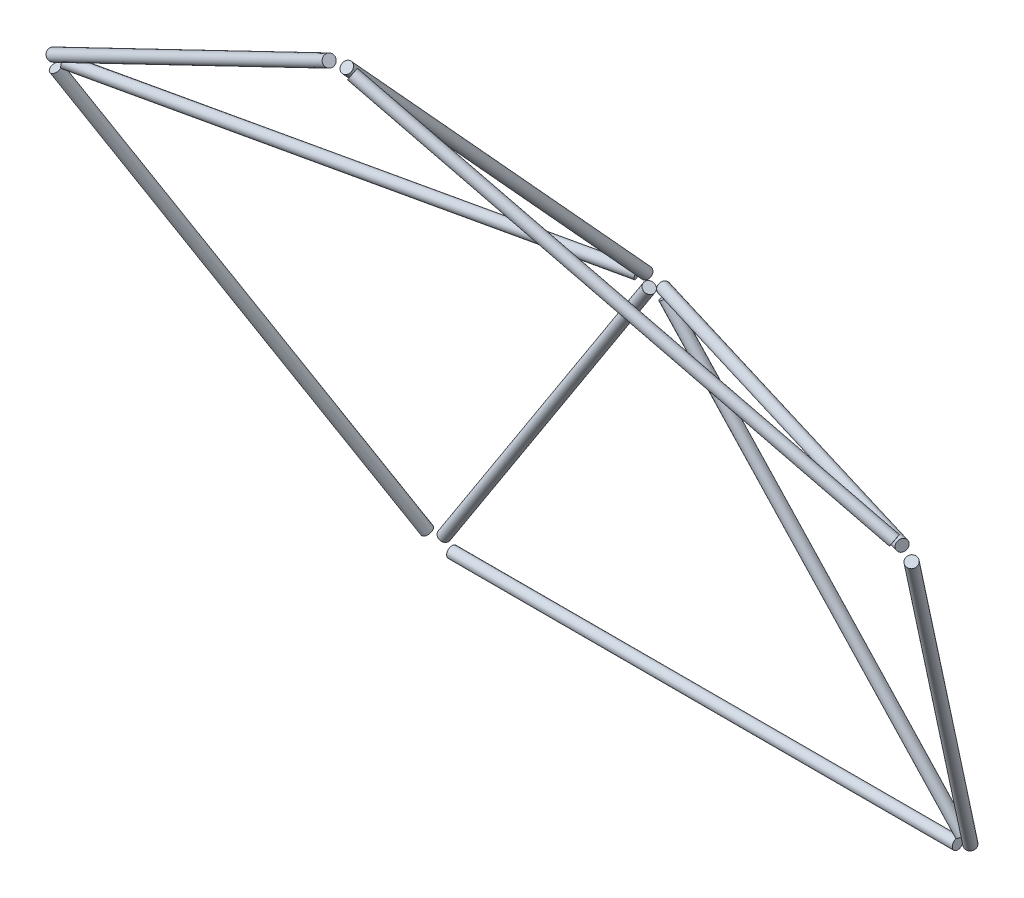
ISO-10303-21;
HEADER;
FILE_DESCRIPTION(('STEP AP214'),'2;1');
FILE_NAME('part.step','',(''),(''),'','','');
FILE_SCHEMA(('AUTOMOTIVE_DESIGN { 1 0 10303 214 1 1 1 1 }'));
ENDSEC;
DATA;
#1=APPLICATION_CONTEXT('core data for automotive mechanical design processes');
#2=APPLICATION_PROTOCOL_DEFINITION('international standard','automotive_design',2000,#1);
#3=PRODUCT_CONTEXT('',#1,'mechanical');
#4=PRODUCT('Part','Part','',(#3));
#5=PRODUCT_RELATED_PRODUCT_CATEGORY('part','',(#4));
#6=PRODUCT_DEFINITION_FORMATION('','',#4);
#7=PRODUCT_DEFINITION_CONTEXT('part definition',#1,'design');
#8=PRODUCT_DEFINITION('design','',#6,#7);
#9=PRODUCT_DEFINITION_SHAPE('','',#8);
#10=(LENGTH_UNIT() NAMED_UNIT(*) SI_UNIT(.MILLI.,.METRE.));
#11=(NAMED_UNIT(*) PLANE_ANGLE_UNIT() SI_UNIT($,.RADIAN.));
#12=(NAMED_UNIT(*) SI_UNIT($,.STERADIAN.) SOLID_ANGLE_UNIT());
#13=UNCERTAINTY_MEASURE_WITH_UNIT(LENGTH_MEASURE(1.E-05),#10,'distance_accuracy_value','');
#14=(GEOMETRIC_REPRESENTATION_CONTEXT(3) GLOBAL_UNCERTAINTY_ASSIGNED_CONTEXT((#13)) GLOBAL_UNIT_ASSIGNED_CONTEXT((#10,
#11,#12)) REPRESENTATION_CONTEXT('',''));
#15=CARTESIAN_POINT('',(0.,0.,0.));
#16=DIRECTION('',(0.,0.,1.));
#17=DIRECTION('',(1.,0.,0.));
#18=AXIS2_PLACEMENT_3D('',#15,#16,#17);
#19=CARTESIAN_POINT('',(3.23606797750098,202.053269556013,-127.226929132831));
#20=DIRECTION('',(0.809016994374942,-0.525731112119141,-0.262865556059569));
#21=DIRECTION('',(0.,0.447213595499956,-0.894427190999917));
#22=AXIS2_PLACEMENT_3D('',#19,#20,#21);
#23=PLANE('',#22);
#24=CARTESIAN_POINT('',(3.23606797750098,202.053269556013,-127.226929132831));
#25=DIRECTION('',(0.809016994374942,-0.525731112119141,-0.262865556059569));
#26=DIRECTION('',(0.,0.447213595499956,-0.894427190999917));
#27=AXIS2_PLACEMENT_3D('',#24,#25,#26);
#28=CIRCLE('',#27,1.49999999999999);
#29=CARTESIAN_POINT('',(3.23606797750098,202.724089949263,-128.568569919331));
#30=VERTEX_POINT('',#29);
#31=EDGE_CURVE('E68',#30,#30,#28,.T.);
#32=ORIENTED_EDGE('',*,*,#31,.F.);
#33=EDGE_LOOP('',(#32));
#34=FACE_BOUND('',#33,.T.);
#35=ADVANCED_FACE('F62',(#34),#23,.F.);
#36=CARTESIAN_POINT('',(116.763932022501,128.278391357067,-164.114368232304));
#37=DIRECTION('',(0.809016994374942,-0.525731112119141,-0.262865556059569));
#38=DIRECTION('',(0.,0.447213595499956,-0.894427190999917));
#39=AXIS2_PLACEMENT_3D('',#36,#37,#38);
#40=PLANE('',#39);
#41=CARTESIAN_POINT('',(116.763932022501,128.278391357067,-164.114368232304));
#42=DIRECTION('',(0.809016994374942,-0.525731112119141,-0.262865556059569));
#43=DIRECTION('',(0.,0.447213595499956,-0.894427190999917));
#44=AXIS2_PLACEMENT_3D('',#41,#42,#43);
#45=CIRCLE('',#44,1.49999999999999);
#46=CARTESIAN_POINT('',(116.763932022501,128.949211750317,-165.456009018804));
#47=VERTEX_POINT('',#46);
#48=EDGE_CURVE('E13',#47,#47,#45,.T.);
#49=ORIENTED_EDGE('',*,*,#48,.T.);
#50=EDGE_LOOP('',(#49));
#51=FACE_BOUND('',#50,.T.);
#52=ADVANCED_FACE('F77',(#51),#40,.T.);
#53=CARTESIAN_POINT('',(3.23606797750098,202.053269556013,-127.226929132831));
#54=DIRECTION('',(0.809016994374941,-0.525731112119142,-0.262865556059569));
#55=DIRECTION('',(0.,0.447213595499955,-0.894427190999917));
#56=AXIS2_PLACEMENT_3D('',#53,#54,#55);
#57=CYLINDRICAL_SURFACE('',#56,1.49999999999999);
#58=ORIENTED_EDGE('',*,*,#48,.F.);
#59=EDGE_LOOP('',(#58));
#60=FACE_BOUND('',#59,.T.);
#61=ORIENTED_EDGE('',*,*,#31,.T.);
#62=EDGE_LOOP('',(#61));
#63=FACE_BOUND('',#62,.T.);
#64=ADVANCED_FACE('F74',(#60,#63),#57,.T.);
#65=CLOSED_SHELL('',(#35,#52,#64));
#66=MANIFOLD_SOLID_BREP('B2',#65);
#67=CARTESIAN_POINT('',(-116.763932022499,128.278391357069,-164.114368232303));
#68=DIRECTION('',(0.809016994374952,0.525731112119129,0.262865556059564));
#69=DIRECTION('',(0.,0.447213595499955,-0.894427190999918));
#70=AXIS2_PLACEMENT_3D('',#67,#68,#69);
#71=PLANE('',#70);
#72=CARTESIAN_POINT('',(-116.763932022499,128.278391357069,-164.114368232303));
#73=DIRECTION('',(0.809016994374952,0.525731112119129,0.262865556059564));
#74=DIRECTION('',(0.,0.447213595499955,-0.894427190999918));
#75=AXIS2_PLACEMENT_3D('',#72,#73,#74);
#76=CIRCLE('',#75,1.49999999999999);
#77=CARTESIAN_POINT('',(-116.763932022499,128.949211750319,-165.456009018803));
#78=VERTEX_POINT('',#77);
#79=EDGE_CURVE('E125',#78,#78,#76,.T.);
#80=ORIENTED_EDGE('',*,*,#79,.F.);
#81=EDGE_LOOP('',(#80));
#82=FACE_BOUND('',#81,.T.);
#83=ADVANCED_FACE('F119',(#82),#71,.F.);
#84=CARTESIAN_POINT('',(-3.23606797749835,202.053269556013,-127.226929132831));
#85=DIRECTION('',(0.809016994374952,0.525731112119129,0.262865556059564));
#86=DIRECTION('',(0.,0.447213595499955,-0.894427190999918));
#87=AXIS2_PLACEMENT_3D('',#84,#85,#86);
#88=PLANE('',#87);
#89=CARTESIAN_POINT('',(-3.23606797749835,202.053269556013,-127.226929132831));
#90=DIRECTION('',(0.809016994374952,0.525731112119129,0.262865556059564));
#91=DIRECTION('',(0.,0.447213595499955,-0.894427190999918));
#92=AXIS2_PLACEMENT_3D('',#89,#90,#91);
#93=CIRCLE('',#92,1.49999999999999);
#94=CARTESIAN_POINT('',(-3.23606797749835,202.724089949263,-128.568569919331));
#95=VERTEX_POINT('',#94);
#96=EDGE_CURVE('E61',#95,#95,#93,.T.);
#97=ORIENTED_EDGE('',*,*,#96,.T.);
#98=EDGE_LOOP('',(#97));
#99=FACE_BOUND('',#98,.T.);
#100=ADVANCED_FACE('F134',(#99),#88,.T.);
#101=CARTESIAN_POINT('',(-116.763932022499,128.278391357069,-164.114368232303));
#102=DIRECTION('',(0.809016994374952,0.525731112119128,0.262865556059563));
#103=DIRECTION('',(0.,0.447213595499955,-0.894427190999917));
#104=AXIS2_PLACEMENT_3D('',#101,#102,#103);
#105=CYLINDRICAL_SURFACE('',#104,1.49999999999999);
#106=ORIENTED_EDGE('',*,*,#96,.F.);
#107=EDGE_LOOP('',(#106));
#108=FACE_BOUND('',#107,.T.);
#109=ORIENTED_EDGE('',*,*,#79,.T.);
#110=EDGE_LOOP('',(#109));
#111=FACE_BOUND('',#110,.T.);
#112=ADVANCED_FACE('F131',(#108,#111),#105,.T.);
#113=CLOSED_SHELL('',(#83,#100,#112));
#114=MANIFOLD_SOLID_BREP('B8',#113);
#115=CARTESIAN_POINT('',(-75.4001466274869,3.4026032334083,-226.552262294133));
#116=DIRECTION('',(-0.309016994374944,0.850650808352042,0.425325404176018));
#117=DIRECTION('',(0.,0.447213595499956,-0.894427190999917));
#118=AXIS2_PLACEMENT_3D('',#115,#116,#117);
#119=PLANE('',#118);
#120=CARTESIAN_POINT('',(-75.4001466274869,3.4026032334083,-226.552262294133));
#121=DIRECTION('',(-0.309016994374944,0.850650808352042,0.425325404176018));
#122=DIRECTION('',(0.,0.447213595499956,-0.894427190999917));
#123=AXIS2_PLACEMENT_3D('',#120,#121,#122);
#124=CIRCLE('',#123,1.49999999999999);
#125=CARTESIAN_POINT('',(-75.4001466274869,4.07342362665823,-227.893903080633));
#126=VERTEX_POINT('',#125);
#127=EDGE_CURVE('E182',#126,#126,#124,.T.);
#128=ORIENTED_EDGE('',*,*,#127,.F.);
#129=EDGE_LOOP('',(#128));
#130=FACE_BOUND('',#129,.T.);
#131=ADVANCED_FACE('F176',(#130),#119,.F.);
#132=CARTESIAN_POINT('',(-118.763932022499,122.772863675184,-166.867132073245));
#133=DIRECTION('',(-0.309016994374944,0.850650808352042,0.425325404176018));
#134=DIRECTION('',(0.,0.447213595499956,-0.894427190999917));
#135=AXIS2_PLACEMENT_3D('',#132,#133,#134);
#136=PLANE('',#135);
#137=CARTESIAN_POINT('',(-118.763932022499,122.772863675184,-166.867132073245));
#138=DIRECTION('',(-0.309016994374944,0.850650808352042,0.425325404176018));
#139=DIRECTION('',(0.,0.447213595499956,-0.894427190999917));
#140=AXIS2_PLACEMENT_3D('',#137,#138,#139);
#141=CIRCLE('',#140,1.49999999999999);
#142=CARTESIAN_POINT('',(-118.763932022499,123.443684068434,-168.208772859745));
#143=VERTEX_POINT('',#142);
#144=EDGE_CURVE('E118',#143,#143,#141,.T.);
#145=ORIENTED_EDGE('',*,*,#144,.T.);
#146=EDGE_LOOP('',(#145));
#147=FACE_BOUND('',#146,.T.);
#148=ADVANCED_FACE('F191',(#147),#136,.T.);
#149=CARTESIAN_POINT('',(-75.4001466274869,3.4026032334083,-226.552262294133));
#150=DIRECTION('',(-0.309016994374943,0.850650808352043,0.425325404176018));
#151=DIRECTION('',(0.,0.447213595499956,-0.894427190999916));
#152=AXIS2_PLACEMENT_3D('',#149,#150,#151);
#153=CYLINDRICAL_SURFACE('',#152,1.49999999999999);
#154=ORIENTED_EDGE('',*,*,#144,.F.);
#155=EDGE_LOOP('',(#154));
#156=FACE_BOUND('',#155,.T.);
#157=ORIENTED_EDGE('',*,*,#127,.T.);
#158=EDGE_LOOP('',(#157));
#159=FACE_BOUND('',#158,.T.);
#160=ADVANCED_FACE('F188',(#156,#159),#153,.T.);
#161=CLOSED_SHELL('',(#131,#148,#160));
#162=MANIFOLD_SOLID_BREP('B56',#161);
#163=CARTESIAN_POINT('',(70.1640786499876,0.,-228.253563910837));
#164=DIRECTION('',(-1.,0.,0.));
#165=DIRECTION('',(0.,0.447213595499958,-0.894427190999916));
#166=AXIS2_PLACEMENT_3D('',#163,#164,#165);
#167=PLANE('',#166);
#168=CARTESIAN_POINT('',(70.1640786499876,0.,-228.253563910837));
#169=DIRECTION('',(-1.,0.,0.));
#170=DIRECTION('',(0.,0.447213595499958,-0.894427190999916));
#171=AXIS2_PLACEMENT_3D('',#168,#169,#170);
#172=CIRCLE('',#171,1.49999999999999);
#173=CARTESIAN_POINT('',(70.1640786499876,0.670820393249941,-229.595204697337));
#174=VERTEX_POINT('',#173);
#175=EDGE_CURVE('E239',#174,#174,#172,.T.);
#176=ORIENTED_EDGE('',*,*,#175,.F.);
#177=EDGE_LOOP('',(#176));
#178=FACE_BOUND('',#177,.T.);
#179=ADVANCED_FACE('F233',(#178),#167,.F.);
#180=CARTESIAN_POINT('',(-70.1640786499872,3.46944695195361E-13,-228.253563910837));
#181=DIRECTION('',(-1.,0.,0.));
#182=DIRECTION('',(0.,0.447213595499958,-0.894427190999916));
#183=AXIS2_PLACEMENT_3D('',#180,#181,#182);
#184=PLANE('',#183);
#185=CARTESIAN_POINT('',(-70.1640786499872,3.46944695195361E-13,-228.253563910837));
#186=DIRECTION('',(-1.,0.,0.));
#187=DIRECTION('',(0.,0.447213595499958,-0.894427190999916));
#188=AXIS2_PLACEMENT_3D('',#185,#186,#187);
#189=CIRCLE('',#188,1.49999999999999);
#190=CARTESIAN_POINT('',(-70.1640786499872,0.670820393250281,-229.595204697337));
#191=VERTEX_POINT('',#190);
#192=EDGE_CURVE('E175',#191,#191,#189,.T.);
#193=ORIENTED_EDGE('',*,*,#192,.T.);
#194=EDGE_LOOP('',(#193));
#195=FACE_BOUND('',#194,.T.);
#196=ADVANCED_FACE('F248',(#195),#184,.T.);
#197=CARTESIAN_POINT('',(70.1640786499876,0.,-228.253563910837));
#198=DIRECTION('',(-1.,0.,0.));
#199=DIRECTION('',(0.,0.447213595499958,-0.894427190999916));
#200=AXIS2_PLACEMENT_3D('',#197,#198,#199);
#201=CYLINDRICAL_SURFACE('',#200,1.49999999999999);
#202=ORIENTED_EDGE('',*,*,#192,.F.);
#203=EDGE_LOOP('',(#202));
#204=FACE_BOUND('',#203,.T.);
#205=ORIENTED_EDGE('',*,*,#175,.T.);
#206=EDGE_LOOP('',(#205));
#207=FACE_BOUND('',#206,.T.);
#208=ADVANCED_FACE('F245',(#204,#207),#201,.T.);
#209=CLOSED_SHELL('',(#179,#196,#208));
#210=MANIFOLD_SOLID_BREP('B113',#209);
#211=CARTESIAN_POINT('',(3.65943097377854,107.90592178459,-213.153111338432));
#212=DIRECTION('',(0.914857743444657,0.143664716150187,0.377353625387165));
#213=DIRECTION('',(-0.229343174999498,0.954060902804784,0.19279393616105));
#214=AXIS2_PLACEMENT_3D('',#211,#212,#213);
#215=PLANE('',#214);
#216=CARTESIAN_POINT('',(3.65943097377854,107.90592178459,-213.153111338432));
#217=DIRECTION('',(0.914857743444657,0.143664716150187,0.377353625387165));
#218=DIRECTION('',(-0.229343174999498,0.954060902804784,0.19279393616105));
#219=AXIS2_PLACEMENT_3D('',#216,#217,#218);
#220=CIRCLE('',#219,1.5);
#221=CARTESIAN_POINT('',(3.31541621127929,109.337013138797,-212.86392043419));
#222=VERTEX_POINT('',#221);
#223=EDGE_CURVE('E296',#222,#222,#220,.T.);
#224=ORIENTED_EDGE('',*,*,#223,.F.);
#225=EDGE_LOOP('',(#224));
#226=FACE_BOUND('',#225,.T.);
#227=ADVANCED_FACE('F290',(#226),#215,.F.);
#228=CARTESIAN_POINT('',(116.340569026222,125.60080804399,-166.675244958091));
#229=DIRECTION('',(0.914857743444657,0.143664716150187,0.377353625387165));
#230=DIRECTION('',(-0.229343174999498,0.954060902804784,0.19279393616105));
#231=AXIS2_PLACEMENT_3D('',#228,#229,#230);
#232=PLANE('',#231);
#233=CARTESIAN_POINT('',(116.340569026222,125.60080804399,-166.675244958091));
#234=DIRECTION('',(0.914857743444657,0.143664716150187,0.377353625387165));
#235=DIRECTION('',(-0.229343174999498,0.954060902804784,0.19279393616105));
#236=AXIS2_PLACEMENT_3D('',#233,#234,#235);
#237=CIRCLE('',#236,1.5);
#238=CARTESIAN_POINT('',(115.996554263722,127.031899398197,-166.386054053849));
#239=VERTEX_POINT('',#238);
#240=EDGE_CURVE('E232',#239,#239,#237,.T.);
#241=ORIENTED_EDGE('',*,*,#240,.T.);
#242=EDGE_LOOP('',(#241));
#243=FACE_BOUND('',#242,.T.);
#244=ADVANCED_FACE('F305',(#243),#232,.T.);
#245=CARTESIAN_POINT('',(3.65943097377854,107.90592178459,-213.153111338432));
#246=DIRECTION('',(0.914857743444657,0.143664716150186,0.377353625387164));
#247=DIRECTION('',(-0.229343174999497,0.954060902804784,0.192793936161051));
#248=AXIS2_PLACEMENT_3D('',#245,#246,#247);
#249=CYLINDRICAL_SURFACE('',#248,1.5);
#250=ORIENTED_EDGE('',*,*,#240,.F.);
#251=EDGE_LOOP('',(#250));
#252=FACE_BOUND('',#251,.T.);
#253=ORIENTED_EDGE('',*,*,#223,.T.);
#254=EDGE_LOOP('',(#253));
#255=FACE_BOUND('',#254,.T.);
#256=ADVANCED_FACE('F302',(#252,#255),#249,.T.);
#257=CLOSED_SHELL('',(#227,#244,#256));
#258=MANIFOLD_SOLID_BREP('B170',#257);
#259=CARTESIAN_POINT('',(4.37150315946155E-13,110.283964185361,-211.964090138046));
#260=DIRECTION('',(0.,0.738175316342915,0.674608925483526));
#261=DIRECTION('',(-0.964443775627104,0.178291116075975,-0.195090957203353));
#262=AXIS2_PLACEMENT_3D('',#259,#260,#261);
#263=PLANE('',#262);
#264=CARTESIAN_POINT('',(4.37150315946155E-13,110.283964185361,-211.964090138046));
#265=DIRECTION('',(0.,0.738175316342915,0.674608925483526));
#266=DIRECTION('',(-0.964443775627104,0.178291116075975,-0.195090957203353));
#267=AXIS2_PLACEMENT_3D('',#264,#265,#266);
#268=CIRCLE('',#267,1.5);
#269=CARTESIAN_POINT('',(-1.44666566344021,110.551400859475,-212.256726573851));
#270=VERTEX_POINT('',#269);
#271=EDGE_CURVE('E351',#270,#270,#268,.T.);
#272=ORIENTED_EDGE('',*,*,#271,.F.);
#273=EDGE_LOOP('',(#272));
#274=FACE_BOUND('',#273,.T.);
#275=ADVANCED_FACE('F345',(#274),#263,.F.);
#276=CARTESIAN_POINT('',(1.45716771982052E-12,201.203492739118,-128.873902610527));
#277=DIRECTION('',(0.,0.738175316342915,0.674608925483526));
#278=DIRECTION('',(-0.964443775627104,0.178291116075975,-0.195090957203353));
#279=AXIS2_PLACEMENT_3D('',#276,#277,#278);
#280=PLANE('',#279);
#281=CARTESIAN_POINT('',(1.45716771982052E-12,201.203492739118,-128.873902610527));
#282=DIRECTION('',(0.,0.738175316342915,0.674608925483526));
#283=DIRECTION('',(-0.964443775627104,0.178291116075975,-0.195090957203353));
#284=AXIS2_PLACEMENT_3D('',#281,#282,#283);
#285=CIRCLE('',#284,1.5);
#286=CARTESIAN_POINT('',(-1.44666566343919,201.470929413231,-129.166539046332));
#287=VERTEX_POINT('',#286);
#288=EDGE_CURVE('E289',#287,#287,#285,.T.);
#289=ORIENTED_EDGE('',*,*,#288,.T.);
#290=EDGE_LOOP('',(#289));
#291=FACE_BOUND('',#290,.T.);
#292=ADVANCED_FACE('F360',(#291),#280,.T.);
#293=CARTESIAN_POINT('',(4.37150315946155E-13,110.283964185361,-211.964090138046));
#294=DIRECTION('',(0.,0.738175316342915,0.674608925483526));
#295=DIRECTION('',(-0.964443775627104,0.178291116075975,-0.195090957203353));
#296=AXIS2_PLACEMENT_3D('',#293,#294,#295);
#297=CYLINDRICAL_SURFACE('',#296,1.5);
#298=ORIENTED_EDGE('',*,*,#288,.F.);
#299=EDGE_LOOP('',(#298));
#300=FACE_BOUND('',#299,.T.);
#301=ORIENTED_EDGE('',*,*,#271,.T.);
#302=EDGE_LOOP('',(#301));
#303=FACE_BOUND('',#302,.T.);
#304=ADVANCED_FACE('F357',(#300,#303),#297,.T.);
#305=CLOSED_SHELL('',(#275,#292,#304));
#306=MANIFOLD_SOLID_BREP('B227',#305);
#307=CARTESIAN_POINT('',(-3.65943097377783,107.90592178459,-213.153111338432));
#308=DIRECTION('',(-0.914857743444653,0.1436647161502,0.377353625387169));
#309=DIRECTION('',(-0.366715858576323,-0.686748851889798,-0.627610941186237));
#310=AXIS2_PLACEMENT_3D('',#307,#308,#309);
#311=PLANE('',#310);
#312=CARTESIAN_POINT('',(-3.65943097377783,107.90592178459,-213.153111338432));
#313=DIRECTION('',(-0.914857743444653,0.1436647161502,0.377353625387169));
#314=DIRECTION('',(-0.366715858576323,-0.686748851889798,-0.627610941186237));
#315=AXIS2_PLACEMENT_3D('',#312,#313,#314);
#316=CIRCLE('',#315,1.5);
#317=CARTESIAN_POINT('',(-4.20950476164232,106.875798506756,-214.094527750211));
#318=VERTEX_POINT('',#317);
#319=EDGE_CURVE('E402',#318,#318,#316,.T.);
#320=ORIENTED_EDGE('',*,*,#319,.F.);
#321=EDGE_LOOP('',(#320));
#322=FACE_BOUND('',#321,.T.);
#323=ADVANCED_FACE('F396',(#322),#311,.F.);
#324=CARTESIAN_POINT('',(-116.34056902622,125.600808043992,-166.67524495809));
#325=DIRECTION('',(-0.914857743444653,0.1436647161502,0.377353625387169));
#326=DIRECTION('',(-0.366715858576323,-0.686748851889798,-0.627610941186237));
#327=AXIS2_PLACEMENT_3D('',#324,#325,#326);
#328=PLANE('',#327);
#329=CARTESIAN_POINT('',(-116.34056902622,125.600808043992,-166.67524495809));
#330=DIRECTION('',(-0.914857743444653,0.1436647161502,0.377353625387169));
#331=DIRECTION('',(-0.366715858576323,-0.686748851889798,-0.627610941186237));
#332=AXIS2_PLACEMENT_3D('',#329,#330,#331);
#333=CIRCLE('',#332,1.5);
#334=CARTESIAN_POINT('',(-116.890642814085,124.570684766157,-167.616661369869));
#335=VERTEX_POINT('',#334);
#336=EDGE_CURVE('E344',#335,#335,#333,.T.);
#337=ORIENTED_EDGE('',*,*,#336,.T.);
#338=EDGE_LOOP('',(#337));
#339=FACE_BOUND('',#338,.T.);
#340=ADVANCED_FACE('F411',(#339),#328,.T.);
#341=CARTESIAN_POINT('',(-3.65943097377783,107.90592178459,-213.153111338432));
#342=DIRECTION('',(-0.914857743444653,0.143664716150201,0.37735362538717));
#343=DIRECTION('',(-0.366715858576324,-0.686748851889798,-0.627610941186237));
#344=AXIS2_PLACEMENT_3D('',#341,#342,#343);
#345=CYLINDRICAL_SURFACE('',#344,1.5);
#346=ORIENTED_EDGE('',*,*,#336,.F.);
#347=EDGE_LOOP('',(#346));
#348=FACE_BOUND('',#347,.T.);
#349=ORIENTED_EDGE('',*,*,#319,.T.);
#350=EDGE_LOOP('',(#349));
#351=FACE_BOUND('',#350,.T.);
#352=ADVANCED_FACE('F408',(#348,#351),#345,.T.);
#353=CLOSED_SHELL('',(#323,#340,#352));
#354=MANIFOLD_SOLID_BREP('B284',#353);
#355=CARTESIAN_POINT('',(-2.26165272127879,104.058168353455,-215.076988053999));
#356=DIRECTION('',(-0.56541318031983,-0.818273641633722,-0.10361555350479));
#357=DIRECTION('',(0.737800910813338,-0.445603166990952,-0.507038098736813));
#358=AXIS2_PLACEMENT_3D('',#355,#356,#357);
#359=PLANE('',#358);
#360=CARTESIAN_POINT('',(-2.26165272127879,104.058168353455,-215.076988053999));
#361=DIRECTION('',(-0.56541318031983,-0.818273641633722,-0.10361555350479));
#362=DIRECTION('',(0.737800910813338,-0.445603166990952,-0.507038098736813));
#363=AXIS2_PLACEMENT_3D('',#360,#361,#362);
#364=CIRCLE('',#363,1.5);
#365=CARTESIAN_POINT('',(-1.15495135505878,103.389763602969,-215.837545202104));
#366=VERTEX_POINT('',#365);
#367=EDGE_CURVE('E459',#366,#366,#364,.T.);
#368=ORIENTED_EDGE('',*,*,#367,.F.);
#369=EDGE_LOOP('',(#368));
#370=FACE_BOUND('',#369,.T.);
#371=ADVANCED_FACE('F453',(#370),#359,.F.);
#372=CARTESIAN_POINT('',(-71.9024259287079,3.27309456653526,-227.839101696818));
#373=DIRECTION('',(-0.56541318031983,-0.818273641633722,-0.10361555350479));
#374=DIRECTION('',(0.737800910813338,-0.445603166990952,-0.507038098736813));
#375=AXIS2_PLACEMENT_3D('',#372,#373,#374);
#376=PLANE('',#375);
#377=CARTESIAN_POINT('',(-71.9024259287079,3.27309456653526,-227.839101696818));
#378=DIRECTION('',(-0.56541318031983,-0.818273641633722,-0.10361555350479));
#379=DIRECTION('',(0.737800910813338,-0.445603166990952,-0.507038098736813));
#380=AXIS2_PLACEMENT_3D('',#377,#378,#379);
#381=CIRCLE('',#380,1.5);
#382=CARTESIAN_POINT('',(-70.7957245624879,2.60468981604883,-228.599658844923));
#383=VERTEX_POINT('',#382);
#384=EDGE_CURVE('E395',#383,#383,#381,.T.);
#385=ORIENTED_EDGE('',*,*,#384,.T.);
#386=EDGE_LOOP('',(#385));
#387=FACE_BOUND('',#386,.T.);
#388=ADVANCED_FACE('F468',(#387),#376,.T.);
#389=CARTESIAN_POINT('',(-2.26165272127879,104.058168353455,-215.076988053999));
#390=DIRECTION('',(-0.56541318031983,-0.818273641633721,-0.103615553504789));
#391=DIRECTION('',(0.737800910813338,-0.445603166990953,-0.507038098736813));
#392=AXIS2_PLACEMENT_3D('',#389,#390,#391);
#393=CYLINDRICAL_SURFACE('',#392,1.5);
#394=ORIENTED_EDGE('',*,*,#384,.F.);
#395=EDGE_LOOP('',(#394));
#396=FACE_BOUND('',#395,.T.);
#397=ORIENTED_EDGE('',*,*,#367,.T.);
#398=EDGE_LOOP('',(#397));
#399=FACE_BOUND('',#398,.T.);
#400=ADVANCED_FACE('F465',(#396,#399),#393,.T.);
#401=CLOSED_SHELL('',(#371,#388,#400));
#402=MANIFOLD_SOLID_BREP('B339',#401);
#403=CARTESIAN_POINT('',(118.7639320225,122.772863675184,-166.867132073245));
#404=DIRECTION('',(-0.309016994374946,-0.850650808352041,-0.42532540417602));
#405=DIRECTION('',(0.,0.447213595499957,-0.894427190999916));
#406=AXIS2_PLACEMENT_3D('',#403,#404,#405);
#407=PLANE('',#406);
#408=CARTESIAN_POINT('',(118.7639320225,122.772863675184,-166.867132073245));
#409=DIRECTION('',(-0.309016994374946,-0.850650808352041,-0.42532540417602));
#410=DIRECTION('',(0.,0.447213595499957,-0.894427190999916));
#411=AXIS2_PLACEMENT_3D('',#408,#409,#410);
#412=CIRCLE('',#411,1.49999999999999);
#413=CARTESIAN_POINT('',(118.7639320225,123.443684068434,-168.208772859745));
#414=VERTEX_POINT('',#413);
#415=EDGE_CURVE('E516',#414,#414,#412,.T.);
#416=ORIENTED_EDGE('',*,*,#415,.F.);
#417=EDGE_LOOP('',(#416));
#418=FACE_BOUND('',#417,.T.);
#419=ADVANCED_FACE('F510',(#418),#407,.F.);
#420=CARTESIAN_POINT('',(75.4001466274871,3.40260323340817,-226.552262294133));
#421=DIRECTION('',(-0.309016994374946,-0.850650808352041,-0.42532540417602));
#422=DIRECTION('',(0.,0.447213595499957,-0.894427190999916));
#423=AXIS2_PLACEMENT_3D('',#420,#421,#422);
#424=PLANE('',#423);
#425=CARTESIAN_POINT('',(75.4001466274871,3.40260323340817,-226.552262294133));
#426=DIRECTION('',(-0.309016994374946,-0.850650808352041,-0.42532540417602));
#427=DIRECTION('',(0.,0.447213595499957,-0.894427190999916));
#428=AXIS2_PLACEMENT_3D('',#425,#426,#427);
#429=CIRCLE('',#428,1.49999999999999);
#430=CARTESIAN_POINT('',(75.4001466274871,4.0734236266581,-227.893903080633));
#431=VERTEX_POINT('',#430);
#432=EDGE_CURVE('E452',#431,#431,#429,.T.);
#433=ORIENTED_EDGE('',*,*,#432,.T.);
#434=EDGE_LOOP('',(#433));
#435=FACE_BOUND('',#434,.T.);
#436=ADVANCED_FACE('F525',(#435),#424,.T.);
#437=CARTESIAN_POINT('',(118.7639320225,122.772863675184,-166.867132073245));
#438=DIRECTION('',(-0.309016994374946,-0.850650808352041,-0.425325404176019));
#439=DIRECTION('',(0.,0.447213595499957,-0.894427190999916));
#440=AXIS2_PLACEMENT_3D('',#437,#438,#439);
#441=CYLINDRICAL_SURFACE('',#440,1.49999999999999);
#442=ORIENTED_EDGE('',*,*,#432,.F.);
#443=EDGE_LOOP('',(#442));
#444=FACE_BOUND('',#443,.T.);
#445=ORIENTED_EDGE('',*,*,#415,.T.);
#446=EDGE_LOOP('',(#445));
#447=FACE_BOUND('',#446,.T.);
#448=ADVANCED_FACE('F522',(#444,#447),#441,.T.);
#449=CLOSED_SHELL('',(#419,#436,#448));
#450=MANIFOLD_SOLID_BREP('B390',#449);
#451=CARTESIAN_POINT('',(2.2616527212793,104.058168353455,-215.076988053999));
#452=DIRECTION('',(0.565413180319828,-0.818273641633723,-0.103615553504788));
#453=DIRECTION('',(0.822701898389593,0.568473030482678,0.));
#454=AXIS2_PLACEMENT_3D('',#451,#452,#453);
#455=PLANE('',#454);
#456=CARTESIAN_POINT('',(2.2616527212793,104.058168353455,-215.076988053999));
#457=DIRECTION('',(0.565413180319828,-0.818273641633723,-0.103615553504788));
#458=DIRECTION('',(0.822701898389593,0.568473030482678,0.));
#459=AXIS2_PLACEMENT_3D('',#456,#457,#458);
#460=CIRCLE('',#459,1.5);
#461=CARTESIAN_POINT('',(3.49570556886368,104.910877899179,-215.076988053999));
#462=VERTEX_POINT('',#461);
#463=EDGE_CURVE('E573',#462,#462,#460,.T.);
#464=ORIENTED_EDGE('',*,*,#463,.F.);
#465=EDGE_LOOP('',(#464));
#466=FACE_BOUND('',#465,.T.);
#467=ADVANCED_FACE('F567',(#466),#455,.F.);
#468=CARTESIAN_POINT('',(71.902425928708,3.27309456653489,-227.839101696818));
#469=DIRECTION('',(0.565413180319828,-0.818273641633723,-0.103615553504788));
#470=DIRECTION('',(0.822701898389593,0.568473030482678,0.));
#471=AXIS2_PLACEMENT_3D('',#468,#469,#470);
#472=PLANE('',#471);
#473=CARTESIAN_POINT('',(71.902425928708,3.27309456653489,-227.839101696818));
#474=DIRECTION('',(0.565413180319828,-0.818273641633723,-0.103615553504788));
#475=DIRECTION('',(0.822701898389593,0.568473030482678,0.));
#476=AXIS2_PLACEMENT_3D('',#473,#474,#475);
#477=CIRCLE('',#476,1.5);
#478=CARTESIAN_POINT('',(73.1364787762924,4.12580411225891,-227.839101696818));
#479=VERTEX_POINT('',#478);
#480=EDGE_CURVE('E509',#479,#479,#477,.T.);
#481=ORIENTED_EDGE('',*,*,#480,.T.);
#482=EDGE_LOOP('',(#481));
#483=FACE_BOUND('',#482,.T.);
#484=ADVANCED_FACE('F582',(#483),#472,.T.);
#485=CARTESIAN_POINT('',(2.2616527212793,104.058168353455,-215.076988053999));
#486=DIRECTION('',(0.565413180319827,-0.818273641633723,-0.103615553504789));
#487=DIRECTION('',(0.822701898389594,0.568473030482677,0.));
#488=AXIS2_PLACEMENT_3D('',#485,#486,#487);
#489=CYLINDRICAL_SURFACE('',#488,1.5);
#490=ORIENTED_EDGE('',*,*,#480,.F.);
#491=EDGE_LOOP('',(#490));
#492=FACE_BOUND('',#491,.T.);
#493=ORIENTED_EDGE('',*,*,#463,.T.);
#494=EDGE_LOOP('',(#493));
#495=FACE_BOUND('',#494,.T.);
#496=ADVANCED_FACE('F579',(#492,#495),#489,.T.);
#497=CLOSED_SHELL('',(#467,#484,#496));
#498=MANIFOLD_SOLID_BREP('B447',#497);
#499=ADVANCED_BREP_SHAPE_REPRESENTATION('',(#18,#66,#114,#162,#210,#258,#306,#354,#402,#450,
#498),#14);
#500=SHAPE_DEFINITION_REPRESENTATION(#9,#499);
ENDSEC;
END-ISO-10303-21;
